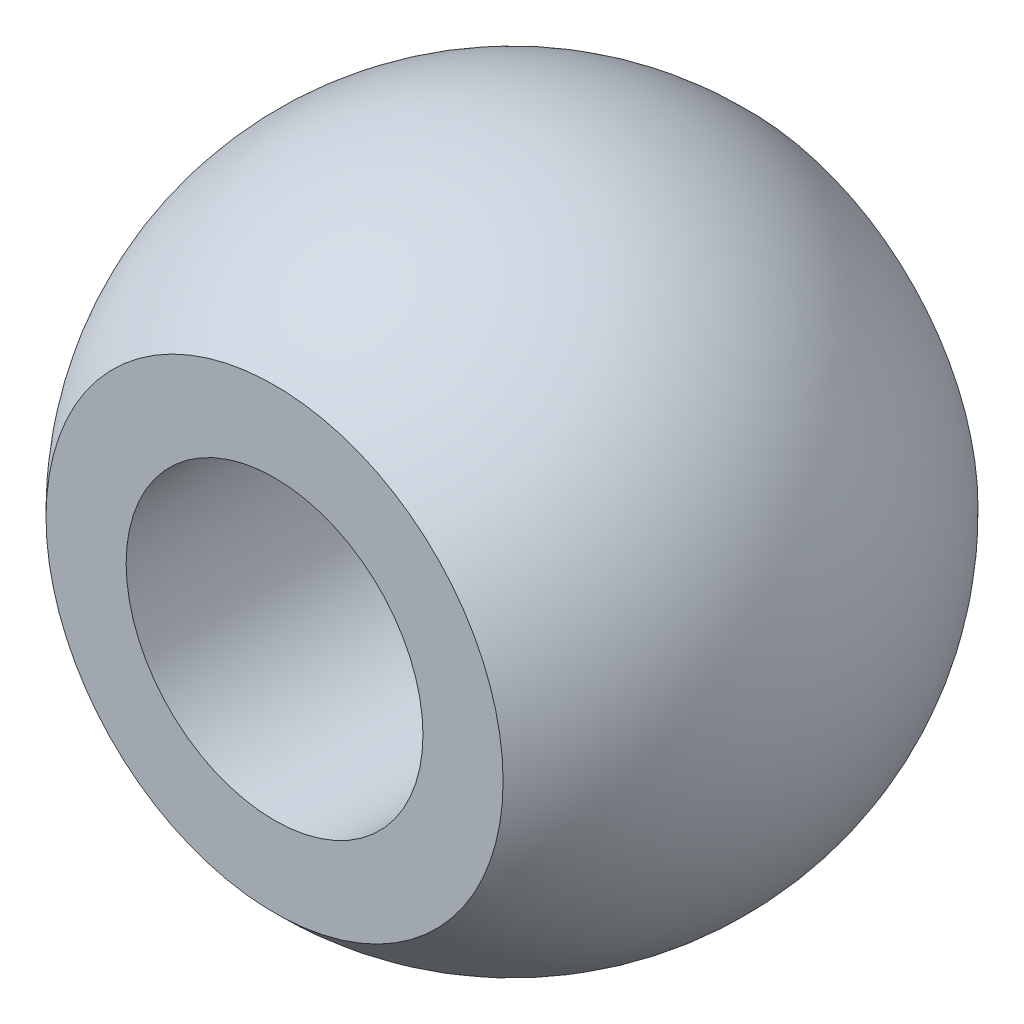
ISO-10303-21;
HEADER;
FILE_DESCRIPTION(('STEP AP214'),'2;1');
FILE_NAME('part.step','',(''),(''),'','','');
FILE_SCHEMA(('AUTOMOTIVE_DESIGN { 1 0 10303 214 1 1 1 1 }'));
ENDSEC;
DATA;
#1=APPLICATION_CONTEXT('core data for automotive mechanical design processes');
#2=APPLICATION_PROTOCOL_DEFINITION('international standard','automotive_design',2000,#1);
#3=PRODUCT_CONTEXT('',#1,'mechanical');
#4=PRODUCT('Part','Part','',(#3));
#5=PRODUCT_RELATED_PRODUCT_CATEGORY('part','',(#4));
#6=PRODUCT_DEFINITION_FORMATION('','',#4);
#7=PRODUCT_DEFINITION_CONTEXT('part definition',#1,'design');
#8=PRODUCT_DEFINITION('design','',#6,#7);
#9=PRODUCT_DEFINITION_SHAPE('','',#8);
#10=(LENGTH_UNIT() NAMED_UNIT(*) SI_UNIT(.MILLI.,.METRE.));
#11=(NAMED_UNIT(*) PLANE_ANGLE_UNIT() SI_UNIT($,.RADIAN.));
#12=(NAMED_UNIT(*) SI_UNIT($,.STERADIAN.) SOLID_ANGLE_UNIT());
#13=UNCERTAINTY_MEASURE_WITH_UNIT(LENGTH_MEASURE(1.E-05),#10,'distance_accuracy_value','');
#14=(GEOMETRIC_REPRESENTATION_CONTEXT(3) GLOBAL_UNCERTAINTY_ASSIGNED_CONTEXT((#13)) GLOBAL_UNIT_ASSIGNED_CONTEXT((#10,
#11,#12)) REPRESENTATION_CONTEXT('',''));
#15=CARTESIAN_POINT('',(0.,0.,0.));
#16=DIRECTION('',(0.,0.,1.));
#17=DIRECTION('',(1.,0.,0.));
#18=AXIS2_PLACEMENT_3D('',#15,#16,#17);
#19=CARTESIAN_POINT('',(36.,8.,4.));
#20=DIRECTION('',(0.,0.,1.));
#21=DIRECTION('',(1.,0.,0.));
#22=AXIS2_PLACEMENT_3D('',#19,#20,#21);
#23=PLANE('',#22);
#24=CARTESIAN_POINT('',(27.,0.,4.));
#25=DIRECTION('',(0.,0.,-1.));
#26=DIRECTION('',(1.,0.,0.));
#27=AXIS2_PLACEMENT_3D('',#24,#25,#26);
#28=CIRCLE('',#27,3.85);
#29=CARTESIAN_POINT('',(30.85,0.,4.));
#30=VERTEX_POINT('',#29);
#31=EDGE_CURVE('E12',#30,#30,#28,.T.);
#32=ORIENTED_EDGE('',*,*,#31,.F.);
#33=EDGE_LOOP('',(#32));
#34=FACE_BOUND('',#33,.T.);
#35=CARTESIAN_POINT('',(27.,0.,4.));
#36=DIRECTION('',(0.,0.,1.));
#37=DIRECTION('',(1.,0.,0.));
#38=AXIS2_PLACEMENT_3D('',#35,#36,#37);
#39=CIRCLE('',#38,2.5);
#40=CARTESIAN_POINT('',(29.5,0.,4.));
#41=VERTEX_POINT('',#40);
#42=EDGE_CURVE('E42',#41,#41,#39,.T.);
#43=ORIENTED_EDGE('',*,*,#42,.F.);
#44=EDGE_LOOP('',(#43));
#45=FACE_BOUND('',#44,.T.);
#46=ADVANCED_FACE('F20',(#34,#45),#23,.T.);
#47=CARTESIAN_POINT('',(27.,0.,0.));
#48=DIRECTION('',(1.,0.,0.));
#49=DIRECTION('',(0.,-1.,0.));
#50=AXIS2_PLACEMENT_3D('',#47,#48,#49);
#51=SPHERICAL_SURFACE('',#50,5.55180150942016);
#52=CARTESIAN_POINT('',(27.,0.,0.));
#53=DIRECTION('',(0.,0.,1.));
#54=DIRECTION('',(-1.,0.,0.));
#55=AXIS2_PLACEMENT_3D('',#52,#53,#54);
#56=SPHERICAL_SURFACE('',#55,5.55180150942016);
#57=CARTESIAN_POINT('',(27.,0.,-4.));
#58=DIRECTION('',(0.,0.,1.));
#59=DIRECTION('',(-1.,0.,0.));
#60=AXIS2_PLACEMENT_3D('',#57,#58,#59);
#61=CIRCLE('',#60,3.85);
#62=CARTESIAN_POINT('',(23.15,0.,-4.));
#63=VERTEX_POINT('',#62);
#64=EDGE_CURVE('E26',#63,#63,#61,.T.);
#65=ORIENTED_EDGE('',*,*,#64,.T.);
#66=EDGE_LOOP('',(#65));
#67=FACE_BOUND('',#66,.T.);
#68=ORIENTED_EDGE('',*,*,#31,.T.);
#69=EDGE_LOOP('',(#68));
#70=FACE_BOUND('',#69,.T.);
#71=ADVANCED_FACE('F67',(#67,#70),#56,.T.);
#72=CARTESIAN_POINT('',(16.5751842036105,8.,-4.));
#73=DIRECTION('',(0.,0.,-1.));
#74=DIRECTION('',(-1.,0.,0.));
#75=AXIS2_PLACEMENT_3D('',#72,#73,#74);
#76=PLANE('',#75);
#77=ORIENTED_EDGE('',*,*,#64,.F.);
#78=EDGE_LOOP('',(#77));
#79=FACE_BOUND('',#78,.T.);
#80=CARTESIAN_POINT('',(27.,0.,-4.));
#81=DIRECTION('',(0.,0.,1.));
#82=DIRECTION('',(1.,0.,0.));
#83=AXIS2_PLACEMENT_3D('',#80,#81,#82);
#84=CIRCLE('',#83,2.5);
#85=CARTESIAN_POINT('',(29.5,0.,-4.));
#86=VERTEX_POINT('',#85);
#87=EDGE_CURVE('E48',#86,#86,#84,.T.);
#88=ORIENTED_EDGE('',*,*,#87,.T.);
#89=EDGE_LOOP('',(#88));
#90=FACE_BOUND('',#89,.T.);
#91=ADVANCED_FACE('F62',(#79,#90),#76,.T.);
#92=CARTESIAN_POINT('',(27.,0.,4.));
#93=DIRECTION('',(0.,0.,-1.));
#94=DIRECTION('',(-1.,0.,0.));
#95=AXIS2_PLACEMENT_3D('',#92,#93,#94);
#96=CYLINDRICAL_SURFACE('',#95,2.5);
#97=ORIENTED_EDGE('',*,*,#87,.F.);
#98=EDGE_LOOP('',(#97));
#99=FACE_BOUND('',#98,.T.);
#100=ORIENTED_EDGE('',*,*,#42,.T.);
#101=EDGE_LOOP('',(#100));
#102=FACE_BOUND('',#101,.T.);
#103=ADVANCED_FACE('F44',(#99,#102),#96,.F.);
#104=CLOSED_SHELL('',(#46,#71,#91,#103));
#105=MANIFOLD_SOLID_BREP('B1',#104);
#106=ADVANCED_BREP_SHAPE_REPRESENTATION('',(#18,#105),#14);
#107=SHAPE_DEFINITION_REPRESENTATION(#9,#106);
ENDSEC;
END-ISO-10303-21;
